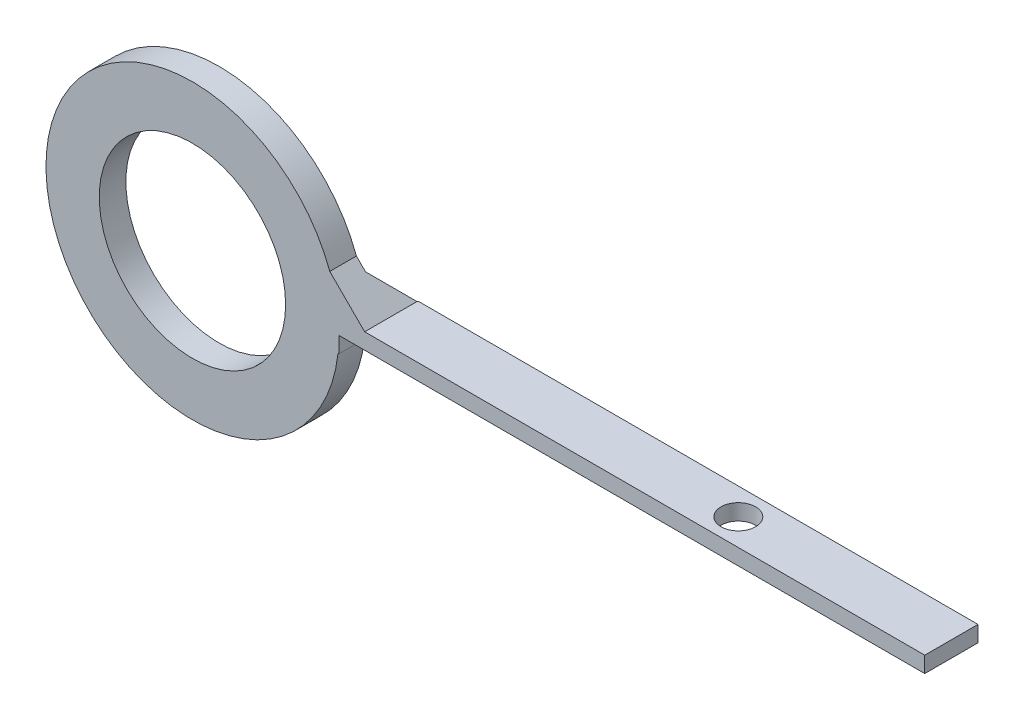
ISO-10303-21;
HEADER;
FILE_DESCRIPTION(('STEP AP214'),'2;1');
FILE_NAME('part.step','',(''),(''),'','','');
FILE_SCHEMA(('AUTOMOTIVE_DESIGN { 1 0 10303 214 1 1 1 1 }'));
ENDSEC;
DATA;
#1=APPLICATION_CONTEXT('core data for automotive mechanical design processes');
#2=APPLICATION_PROTOCOL_DEFINITION('international standard','automotive_design',2000,#1);
#3=PRODUCT_CONTEXT('',#1,'mechanical');
#4=PRODUCT('Part','Part','',(#3));
#5=PRODUCT_RELATED_PRODUCT_CATEGORY('part','',(#4));
#6=PRODUCT_DEFINITION_FORMATION('','',#4);
#7=PRODUCT_DEFINITION_CONTEXT('part definition',#1,'design');
#8=PRODUCT_DEFINITION('design','',#6,#7);
#9=PRODUCT_DEFINITION_SHAPE('','',#8);
#10=(LENGTH_UNIT() NAMED_UNIT(*) SI_UNIT(.MILLI.,.METRE.));
#11=(NAMED_UNIT(*) PLANE_ANGLE_UNIT() SI_UNIT($,.RADIAN.));
#12=(NAMED_UNIT(*) SI_UNIT($,.STERADIAN.) SOLID_ANGLE_UNIT());
#13=UNCERTAINTY_MEASURE_WITH_UNIT(LENGTH_MEASURE(1.E-05),#10,'distance_accuracy_value','');
#14=(GEOMETRIC_REPRESENTATION_CONTEXT(3) GLOBAL_UNCERTAINTY_ASSIGNED_CONTEXT((#13)) GLOBAL_UNIT_ASSIGNED_CONTEXT((#10,
#11,#12)) REPRESENTATION_CONTEXT('',''));
#15=CARTESIAN_POINT('',(0.,0.,0.));
#16=DIRECTION('',(0.,0.,1.));
#17=DIRECTION('',(1.,0.,0.));
#18=AXIS2_PLACEMENT_3D('',#15,#16,#17);
#19=CARTESIAN_POINT('',(0.,0.,0.));
#20=DIRECTION('',(0.,0.,1.));
#21=DIRECTION('',(1.,0.,0.));
#22=AXIS2_PLACEMENT_3D('',#19,#20,#21);
#23=PLANE('',#22);
#24=CARTESIAN_POINT('',(0.,0.,0.));
#25=DIRECTION('',(0.,0.,1.));
#26=DIRECTION('',(1.,0.,0.));
#27=AXIS2_PLACEMENT_3D('',#24,#25,#26);
#28=CIRCLE('',#27,17.5);
#29=CARTESIAN_POINT('',(17.5,0.,0.));
#30=VERTEX_POINT('',#29);
#31=EDGE_CURVE('E155',#30,#30,#28,.T.);
#32=ORIENTED_EDGE('',*,*,#31,.T.);
#33=EDGE_LOOP('',(#32));
#34=FACE_BOUND('',#33,.T.);
#35=DIRECTION('',(0.,1.,0.));
#36=VECTOR('',#35,1.);
#37=CARTESIAN_POINT('',(27.5,-3.,0.));
#38=LINE('',#37,#36);
#39=CARTESIAN_POINT('',(27.5,-3.,0.));
#40=VERTEX_POINT('',#39);
#41=CARTESIAN_POINT('',(27.5,0.,0.));
#42=VERTEX_POINT('',#41);
#43=EDGE_CURVE('E113',#40,#42,#38,.T.);
#44=ORIENTED_EDGE('',*,*,#43,.F.);
#45=DIRECTION('',(-1.,0.,0.));
#46=VECTOR('',#45,1.);
#47=CARTESIAN_POINT('',(157.5,-3.,0.));
#48=LINE('',#47,#46);
#49=CARTESIAN_POINT('',(27.3358738656733,-3.,0.));
#50=VERTEX_POINT('',#49);
#51=EDGE_CURVE('E132',#40,#50,#48,.T.);
#52=ORIENTED_EDGE('',*,*,#51,.T.);
#53=CARTESIAN_POINT('',(0.,0.,0.));
#54=DIRECTION('',(0.,0.,1.));
#55=DIRECTION('',(1.,0.,0.));
#56=AXIS2_PLACEMENT_3D('',#53,#54,#55);
#57=CIRCLE('',#56,27.5);
#58=CARTESIAN_POINT('',(25.7900674745915,9.54580639108185,0.));
#59=VERTEX_POINT('',#58);
#60=EDGE_CURVE('E159',#59,#50,#57,.T.);
#61=ORIENTED_EDGE('',*,*,#60,.F.);
#62=DIRECTION('',(0.707106781186545,-0.70710678118655,0.));
#63=VECTOR('',#62,1.);
#64=CARTESIAN_POINT('',(17.6679369328368,17.6679369328366,0.));
#65=LINE('',#64,#63);
#66=CARTESIAN_POINT('',(27.5,7.83587386567329,0.));
#67=VERTEX_POINT('',#66);
#68=EDGE_CURVE('E130',#59,#67,#65,.T.);
#69=ORIENTED_EDGE('',*,*,#68,.T.);
#70=DIRECTION('',(0.,1.,0.));
#71=VECTOR('',#70,1.);
#72=CARTESIAN_POINT('',(27.5,3.,0.));
#73=LINE('',#72,#71);
#74=EDGE_CURVE('E49',#42,#67,#73,.T.);
#75=ORIENTED_EDGE('',*,*,#74,.F.);
#76=EDGE_LOOP('',(#44,#52,#61,#69,#75));
#77=FACE_BOUND('',#76,.T.);
#78=ADVANCED_FACE('F33',(#34,#77),#23,.F.);
#79=CARTESIAN_POINT('',(17.5,-3.,-5.));
#80=DIRECTION('',(0.,-1.,0.));
#81=DIRECTION('',(0.,0.,-1.));
#82=AXIS2_PLACEMENT_3D('',#79,#80,#81);
#83=PLANE('',#82);
#84=ORIENTED_EDGE('',*,*,#51,.F.);
#85=DIRECTION('',(0.,0.,-1.));
#86=VECTOR('',#85,1.);
#87=CARTESIAN_POINT('',(27.5,-3.,0.));
#88=LINE('',#87,#86);
#89=CARTESIAN_POINT('',(27.5,-3.,5.));
#90=VERTEX_POINT('',#89);
#91=EDGE_CURVE('E118',#90,#40,#88,.T.);
#92=ORIENTED_EDGE('',*,*,#91,.F.);
#93=DIRECTION('',(1.,0.,0.));
#94=VECTOR('',#93,1.);
#95=CARTESIAN_POINT('',(17.5,-3.,5.));
#96=LINE('',#95,#94);
#97=CARTESIAN_POINT('',(27.3358738656733,-3.,5.));
#98=VERTEX_POINT('',#97);
#99=EDGE_CURVE('E140',#98,#90,#96,.T.);
#100=ORIENTED_EDGE('',*,*,#99,.F.);
#101=DIRECTION('',(0.,0.,-1.));
#102=VECTOR('',#101,1.);
#103=CARTESIAN_POINT('',(27.3358738656733,-3.,5.));
#104=LINE('',#103,#102);
#105=EDGE_CURVE('E164',#50,#98,#104,.F.);
#106=ORIENTED_EDGE('',*,*,#105,.F.);
#107=EDGE_LOOP('',(#84,#92,#100,#106));
#108=FACE_BOUND('',#107,.T.);
#109=ADVANCED_FACE('F192',(#108),#83,.T.);
#110=CARTESIAN_POINT('',(0.,0.,-5.));
#111=DIRECTION('',(0.,0.,1.));
#112=DIRECTION('',(1.,0.,0.));
#113=AXIS2_PLACEMENT_3D('',#110,#111,#112);
#114=PLANE('',#113);
#115=DIRECTION('',(-1.,0.,0.));
#116=VECTOR('',#115,1.);
#117=CARTESIAN_POINT('',(0.,0.,-5.));
#118=LINE('',#117,#116);
#119=CARTESIAN_POINT('',(137.5,0.,-5.));
#120=VERTEX_POINT('',#119);
#121=CARTESIAN_POINT('',(32.5,0.,-5.));
#122=VERTEX_POINT('',#121);
#123=EDGE_CURVE('E127',#120,#122,#118,.T.);
#124=ORIENTED_EDGE('',*,*,#123,.T.);
#125=DIRECTION('',(0.,1.,0.));
#126=VECTOR('',#125,1.);
#127=CARTESIAN_POINT('',(32.5,3.,-5.));
#128=LINE('',#127,#126);
#129=CARTESIAN_POINT('',(32.5,3.,-5.));
#130=VERTEX_POINT('',#129);
#131=EDGE_CURVE('E126',#122,#130,#128,.T.);
#132=ORIENTED_EDGE('',*,*,#131,.T.);
#133=DIRECTION('',(-1.,0.,0.));
#134=VECTOR('',#133,1.);
#135=CARTESIAN_POINT('',(17.5,3.,-5.));
#136=LINE('',#135,#134);
#137=CARTESIAN_POINT('',(137.5,3.,-5.));
#138=VERTEX_POINT('',#137);
#139=EDGE_CURVE('E143',#138,#130,#136,.T.);
#140=ORIENTED_EDGE('',*,*,#139,.F.);
#141=DIRECTION('',(0.,1.,0.));
#142=VECTOR('',#141,1.);
#143=CARTESIAN_POINT('',(137.5,3.,-5.));
#144=LINE('',#143,#142);
#145=EDGE_CURVE('E141',#120,#138,#144,.T.);
#146=ORIENTED_EDGE('',*,*,#145,.F.);
#147=EDGE_LOOP('',(#124,#132,#140,#146));
#148=FACE_BOUND('',#147,.T.);
#149=ADVANCED_FACE('F228',(#148),#114,.F.);
#150=CARTESIAN_POINT('',(157.5,0.,-5.));
#151=DIRECTION('',(0.,1.,0.));
#152=DIRECTION('',(0.,0.,1.));
#153=AXIS2_PLACEMENT_3D('',#150,#151,#152);
#154=PLANE('',#153);
#155=CARTESIAN_POINT('',(97.5,0.,0.));
#156=DIRECTION('',(0.,-1.,0.));
#157=DIRECTION('',(0.,0.,-1.));
#158=AXIS2_PLACEMENT_3D('',#155,#156,#157);
#159=CIRCLE('',#158,3.25000000000001);
#160=CARTESIAN_POINT('',(97.5,0.,-3.25000000000001));
#161=VERTEX_POINT('',#160);
#162=EDGE_CURVE('E196',#161,#161,#159,.T.);
#163=ORIENTED_EDGE('',*,*,#162,.F.);
#164=EDGE_LOOP('',(#163));
#165=FACE_BOUND('',#164,.T.);
#166=DIRECTION('',(0.,0.,1.));
#167=VECTOR('',#166,1.);
#168=CARTESIAN_POINT('',(137.5,0.,-5.));
#169=LINE('',#168,#167);
#170=CARTESIAN_POINT('',(137.5,0.,5.));
#171=VERTEX_POINT('',#170);
#172=EDGE_CURVE('E134',#120,#171,#169,.T.);
#173=ORIENTED_EDGE('',*,*,#172,.T.);
#174=DIRECTION('',(1.,0.,0.));
#175=VECTOR('',#174,1.);
#176=CARTESIAN_POINT('',(27.5,0.,5.));
#177=LINE('',#176,#175);
#178=CARTESIAN_POINT('',(27.5,0.,5.));
#179=VERTEX_POINT('',#178);
#180=EDGE_CURVE('E109',#179,#171,#177,.T.);
#181=ORIENTED_EDGE('',*,*,#180,.F.);
#182=DIRECTION('',(0.,0.,1.));
#183=VECTOR('',#182,1.);
#184=CARTESIAN_POINT('',(27.5,0.,0.));
#185=LINE('',#184,#183);
#186=EDGE_CURVE('E103',#42,#179,#185,.T.);
#187=ORIENTED_EDGE('',*,*,#186,.F.);
#188=DIRECTION('',(0.707106781186549,0.,-0.707106781186546));
#189=VECTOR('',#188,1.);
#190=CARTESIAN_POINT('',(27.5,0.,0.));
#191=LINE('',#190,#189);
#192=EDGE_CURVE('E106',#42,#122,#191,.T.);
#193=ORIENTED_EDGE('',*,*,#192,.T.);
#194=ORIENTED_EDGE('',*,*,#123,.F.);
#195=EDGE_LOOP('',(#173,#181,#187,#193,#194));
#196=FACE_BOUND('',#195,.T.);
#197=ADVANCED_FACE('F105',(#165,#196),#154,.F.);
#198=CARTESIAN_POINT('',(0.,0.,5.));
#199=DIRECTION('',(0.,0.,1.));
#200=DIRECTION('',(1.,0.,0.));
#201=AXIS2_PLACEMENT_3D('',#198,#199,#200);
#202=PLANE('',#201);
#203=ORIENTED_EDGE('',*,*,#180,.T.);
#204=DIRECTION('',(0.,1.,0.));
#205=VECTOR('',#204,1.);
#206=CARTESIAN_POINT('',(137.5,3.,5.));
#207=LINE('',#206,#205);
#208=CARTESIAN_POINT('',(137.5,3.,5.));
#209=VERTEX_POINT('',#208);
#210=EDGE_CURVE('E150',#171,#209,#207,.T.);
#211=ORIENTED_EDGE('',*,*,#210,.T.);
#212=DIRECTION('',(-1.,0.,0.));
#213=VECTOR('',#212,1.);
#214=CARTESIAN_POINT('',(17.5,3.,5.));
#215=LINE('',#214,#213);
#216=CARTESIAN_POINT('',(32.3358738656733,3.,5.));
#217=VERTEX_POINT('',#216);
#218=EDGE_CURVE('E144',#209,#217,#215,.T.);
#219=ORIENTED_EDGE('',*,*,#218,.T.);
#220=DIRECTION('',(-0.707106781186545,0.70710678118655,0.));
#221=VECTOR('',#220,1.);
#222=CARTESIAN_POINT('',(25.7900674745915,9.54580639108186,5.));
#223=LINE('',#222,#221);
#224=CARTESIAN_POINT('',(25.7900674745915,9.54580639108185,5.));
#225=VERTEX_POINT('',#224);
#226=EDGE_CURVE('E11',#217,#225,#223,.T.);
#227=ORIENTED_EDGE('',*,*,#226,.T.);
#228=CARTESIAN_POINT('',(0.,0.,5.));
#229=DIRECTION('',(0.,0.,1.));
#230=DIRECTION('',(1.,0.,0.));
#231=AXIS2_PLACEMENT_3D('',#228,#229,#230);
#232=CIRCLE('',#231,27.5);
#233=EDGE_CURVE('E162',#225,#98,#232,.T.);
#234=ORIENTED_EDGE('',*,*,#233,.T.);
#235=ORIENTED_EDGE('',*,*,#99,.T.);
#236=DIRECTION('',(0.,-1.,0.));
#237=VECTOR('',#236,1.);
#238=CARTESIAN_POINT('',(27.5,-3.,5.));
#239=LINE('',#238,#237);
#240=EDGE_CURVE('E112',#179,#90,#239,.T.);
#241=ORIENTED_EDGE('',*,*,#240,.F.);
#242=EDGE_LOOP('',(#203,#211,#219,#227,#234,#235,#241));
#243=FACE_BOUND('',#242,.T.);
#244=CARTESIAN_POINT('',(0.,0.,5.));
#245=DIRECTION('',(0.,0.,1.));
#246=DIRECTION('',(1.,0.,0.));
#247=AXIS2_PLACEMENT_3D('',#244,#245,#246);
#248=CIRCLE('',#247,17.5);
#249=CARTESIAN_POINT('',(17.5,0.,5.));
#250=VERTEX_POINT('',#249);
#251=EDGE_CURVE('E156',#250,#250,#248,.T.);
#252=ORIENTED_EDGE('',*,*,#251,.F.);
#253=EDGE_LOOP('',(#252));
#254=FACE_BOUND('',#253,.T.);
#255=ADVANCED_FACE('F185',(#243,#254),#202,.T.);
#256=CARTESIAN_POINT('',(0.,0.,5.));
#257=DIRECTION('',(0.,0.,-1.));
#258=DIRECTION('',(-1.,0.,0.));
#259=AXIS2_PLACEMENT_3D('',#256,#257,#258);
#260=CYLINDRICAL_SURFACE('',#259,27.5);
#261=ORIENTED_EDGE('',*,*,#233,.F.);
#262=DIRECTION('',(0.,0.,-1.));
#263=VECTOR('',#262,1.);
#264=CARTESIAN_POINT('',(25.7900674745915,9.54580639108185,5.));
#265=LINE('',#264,#263);
#266=EDGE_CURVE('E172',#225,#59,#265,.T.);
#267=ORIENTED_EDGE('',*,*,#266,.T.);
#268=ORIENTED_EDGE('',*,*,#60,.T.);
#269=ORIENTED_EDGE('',*,*,#105,.T.);
#270=EDGE_LOOP('',(#261,#267,#268,#269));
#271=FACE_BOUND('',#270,.T.);
#272=ADVANCED_FACE('F189',(#271),#260,.T.);
#273=CARTESIAN_POINT('',(0.,0.,5.));
#274=DIRECTION('',(0.,0.,-1.));
#275=DIRECTION('',(-1.,0.,0.));
#276=AXIS2_PLACEMENT_3D('',#273,#274,#275);
#277=CYLINDRICAL_SURFACE('',#276,17.5);
#278=ORIENTED_EDGE('',*,*,#31,.F.);
#279=EDGE_LOOP('',(#278));
#280=FACE_BOUND('',#279,.T.);
#281=ORIENTED_EDGE('',*,*,#251,.T.);
#282=EDGE_LOOP('',(#281));
#283=FACE_BOUND('',#282,.T.);
#284=ADVANCED_FACE('F207',(#280,#283),#277,.F.);
#285=CARTESIAN_POINT('',(17.5,3.,-5.));
#286=DIRECTION('',(0.,1.,0.));
#287=DIRECTION('',(0.,0.,1.));
#288=AXIS2_PLACEMENT_3D('',#285,#286,#287);
#289=PLANE('',#288);
#290=CARTESIAN_POINT('',(97.5,3.,0.));
#291=DIRECTION('',(0.,1.,0.));
#292=DIRECTION('',(0.,0.,1.));
#293=AXIS2_PLACEMENT_3D('',#290,#291,#292);
#294=CIRCLE('',#293,3.25000000000001);
#295=CARTESIAN_POINT('',(97.5,3.,3.25000000000001));
#296=VERTEX_POINT('',#295);
#297=EDGE_CURVE('E37',#296,#296,#294,.T.);
#298=ORIENTED_EDGE('',*,*,#297,.F.);
#299=EDGE_LOOP('',(#298));
#300=FACE_BOUND('',#299,.T.);
#301=DIRECTION('',(-0.707106781186549,0.,0.707106781186546));
#302=VECTOR('',#301,1.);
#303=CARTESIAN_POINT('',(25.,3.,2.50000000000002));
#304=LINE('',#303,#302);
#305=CARTESIAN_POINT('',(32.3358738656733,3.,-4.83587386567323));
#306=VERTEX_POINT('',#305);
#307=EDGE_CURVE('E170',#130,#306,#304,.T.);
#308=ORIENTED_EDGE('',*,*,#307,.T.);
#309=DIRECTION('',(0.,0.,1.));
#310=VECTOR('',#309,1.);
#311=CARTESIAN_POINT('',(32.3358738656733,3.,-5.));
#312=LINE('',#311,#310);
#313=EDGE_CURVE('E57',#306,#217,#312,.T.);
#314=ORIENTED_EDGE('',*,*,#313,.T.);
#315=ORIENTED_EDGE('',*,*,#218,.F.);
#316=DIRECTION('',(0.,0.,1.));
#317=VECTOR('',#316,1.);
#318=CARTESIAN_POINT('',(137.5,3.,-5.));
#319=LINE('',#318,#317);
#320=EDGE_CURVE('E147',#138,#209,#319,.T.);
#321=ORIENTED_EDGE('',*,*,#320,.F.);
#322=ORIENTED_EDGE('',*,*,#139,.T.);
#323=EDGE_LOOP('',(#308,#314,#315,#321,#322));
#324=FACE_BOUND('',#323,.T.);
#325=ADVANCED_FACE('F178',(#300,#324),#289,.T.);
#326=CARTESIAN_POINT('',(137.5,3.,-5.));
#327=DIRECTION('',(1.,0.,0.));
#328=DIRECTION('',(0.,0.,-1.));
#329=AXIS2_PLACEMENT_3D('',#326,#327,#328);
#330=PLANE('',#329);
#331=ORIENTED_EDGE('',*,*,#210,.F.);
#332=ORIENTED_EDGE('',*,*,#172,.F.);
#333=ORIENTED_EDGE('',*,*,#145,.T.);
#334=ORIENTED_EDGE('',*,*,#320,.T.);
#335=EDGE_LOOP('',(#331,#332,#333,#334));
#336=FACE_BOUND('',#335,.T.);
#337=ADVANCED_FACE('F206',(#336),#330,.T.);
#338=CARTESIAN_POINT('',(27.5,0.,0.));
#339=DIRECTION('',(-0.707106781186545,0.,-0.707106781186549));
#340=DIRECTION('',(0.,1.,0.));
#341=AXIS2_PLACEMENT_3D('',#338,#339,#340);
#342=PLANE('',#341);
#343=ORIENTED_EDGE('',*,*,#307,.F.);
#344=ORIENTED_EDGE('',*,*,#131,.F.);
#345=ORIENTED_EDGE('',*,*,#192,.F.);
#346=ORIENTED_EDGE('',*,*,#74,.T.);
#347=DIRECTION('',(0.577350269189625,-0.57735026918963,-0.577350269189622));
#348=VECTOR('',#347,1.);
#349=CARTESIAN_POINT('',(24.6933783163943,10.642495549279,2.80662168360568));
#350=LINE('',#349,#348);
#351=EDGE_CURVE('E42',#67,#306,#350,.T.);
#352=ORIENTED_EDGE('',*,*,#351,.T.);
#353=EDGE_LOOP('',(#343,#344,#345,#346,#352));
#354=FACE_BOUND('',#353,.T.);
#355=ADVANCED_FACE('F125',(#354),#342,.T.);
#356=CARTESIAN_POINT('',(27.5,0.,0.));
#357=DIRECTION('',(1.,0.,0.));
#358=DIRECTION('',(0.,0.,-1.));
#359=AXIS2_PLACEMENT_3D('',#356,#357,#358);
#360=PLANE('',#359);
#361=ORIENTED_EDGE('',*,*,#43,.T.);
#362=ORIENTED_EDGE('',*,*,#186,.T.);
#363=ORIENTED_EDGE('',*,*,#240,.T.);
#364=ORIENTED_EDGE('',*,*,#91,.T.);
#365=EDGE_LOOP('',(#361,#362,#363,#364));
#366=FACE_BOUND('',#365,.T.);
#367=ADVANCED_FACE('F116',(#366),#360,.T.);
#368=CARTESIAN_POINT('',(25.7900674745915,9.54580639108186,5.));
#369=DIRECTION('',(-0.70710678118655,-0.707106781186545,0.));
#370=DIRECTION('',(0.,0.,-1.));
#371=AXIS2_PLACEMENT_3D('',#368,#369,#370);
#372=PLANE('',#371);
#373=ORIENTED_EDGE('',*,*,#226,.F.);
#374=ORIENTED_EDGE('',*,*,#313,.F.);
#375=ORIENTED_EDGE('',*,*,#351,.F.);
#376=ORIENTED_EDGE('',*,*,#68,.F.);
#377=ORIENTED_EDGE('',*,*,#266,.F.);
#378=EDGE_LOOP('',(#373,#374,#375,#376,#377));
#379=FACE_BOUND('',#378,.T.);
#380=ADVANCED_FACE('F35',(#379),#372,.F.);
#381=CARTESIAN_POINT('',(97.5,110.,0.));
#382=DIRECTION('',(0.,-1.,0.));
#383=DIRECTION('',(0.,0.,-1.));
#384=AXIS2_PLACEMENT_3D('',#381,#382,#383);
#385=CYLINDRICAL_SURFACE('',#384,3.25000000000001);
#386=ORIENTED_EDGE('',*,*,#297,.T.);
#387=EDGE_LOOP('',(#386));
#388=FACE_BOUND('',#387,.T.);
#389=ORIENTED_EDGE('',*,*,#162,.T.);
#390=EDGE_LOOP('',(#389));
#391=FACE_BOUND('',#390,.T.);
#392=ADVANCED_FACE('F203',(#388,#391),#385,.F.);
#393=CLOSED_SHELL('',(#78,#109,#149,#197,#255,#272,#284,#325,#337,#355,#367,#380,#392));
#394=MANIFOLD_SOLID_BREP('B2',#393);
#395=ADVANCED_BREP_SHAPE_REPRESENTATION('',(#18,#394),#14);
#396=SHAPE_DEFINITION_REPRESENTATION(#9,#395);
ENDSEC;
END-ISO-10303-21;
